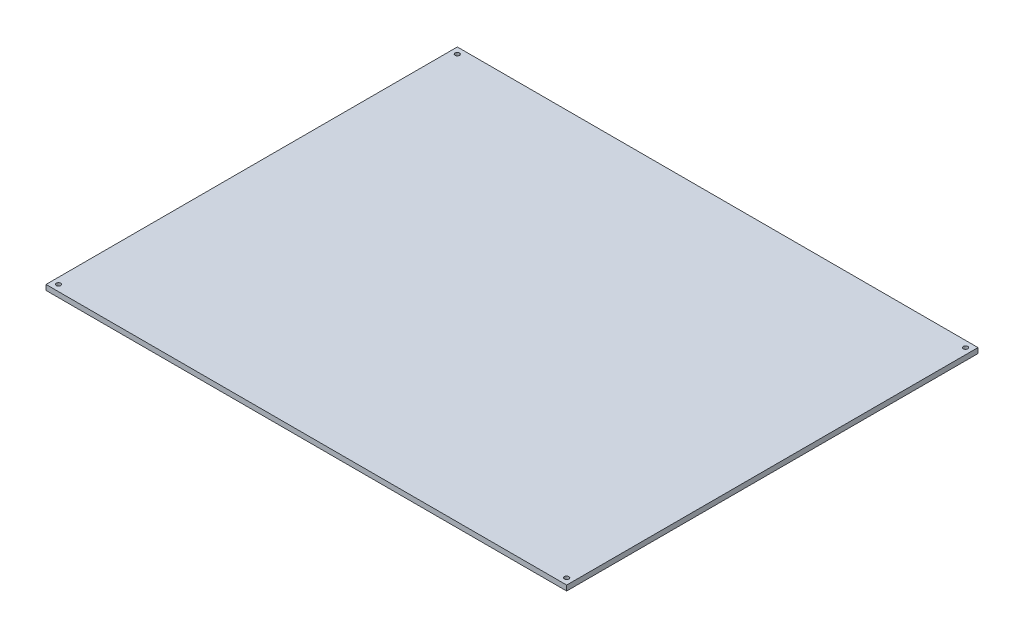
ISO-10303-21;
HEADER;
FILE_DESCRIPTION(('STEP AP214'),'2;1');
FILE_NAME('part.step','',(''),(''),'','','');
FILE_SCHEMA(('AUTOMOTIVE_DESIGN { 1 0 10303 214 1 1 1 1 }'));
ENDSEC;
DATA;
#1=APPLICATION_CONTEXT('core data for automotive mechanical design processes');
#2=APPLICATION_PROTOCOL_DEFINITION('international standard','automotive_design',2000,#1);
#3=PRODUCT_CONTEXT('',#1,'mechanical');
#4=PRODUCT('Part','Part','',(#3));
#5=PRODUCT_RELATED_PRODUCT_CATEGORY('part','',(#4));
#6=PRODUCT_DEFINITION_FORMATION('','',#4);
#7=PRODUCT_DEFINITION_CONTEXT('part definition',#1,'design');
#8=PRODUCT_DEFINITION('design','',#6,#7);
#9=PRODUCT_DEFINITION_SHAPE('','',#8);
#10=(LENGTH_UNIT() NAMED_UNIT(*) SI_UNIT(.MILLI.,.METRE.));
#11=(NAMED_UNIT(*) PLANE_ANGLE_UNIT() SI_UNIT($,.RADIAN.));
#12=(NAMED_UNIT(*) SI_UNIT($,.STERADIAN.) SOLID_ANGLE_UNIT());
#13=UNCERTAINTY_MEASURE_WITH_UNIT(LENGTH_MEASURE(1.E-05),#10,'distance_accuracy_value','');
#14=(GEOMETRIC_REPRESENTATION_CONTEXT(3) GLOBAL_UNCERTAINTY_ASSIGNED_CONTEXT((#13)) GLOBAL_UNIT_ASSIGNED_CONTEXT((#10,
#11,#12)) REPRESENTATION_CONTEXT('',''));
#15=CARTESIAN_POINT('',(0.,0.,0.));
#16=DIRECTION('',(0.,0.,1.));
#17=DIRECTION('',(1.,0.,0.));
#18=AXIS2_PLACEMENT_3D('',#15,#16,#17);
#19=CARTESIAN_POINT('',(0.,5.,0.));
#20=DIRECTION('',(0.,1.,0.));
#21=DIRECTION('',(0.,0.,1.));
#22=AXIS2_PLACEMENT_3D('',#19,#20,#21);
#23=PLANE('',#22);
#24=CARTESIAN_POINT('',(244.,5.,191.5));
#25=DIRECTION('',(0.,-1.,0.));
#26=DIRECTION('',(0.,0.,1.));
#27=AXIS2_PLACEMENT_3D('',#24,#25,#26);
#28=CIRCLE('',#27,2.09999999999999);
#29=CARTESIAN_POINT('',(244.,5.,193.6));
#30=VERTEX_POINT('',#29);
#31=EDGE_CURVE('E120',#30,#30,#28,.T.);
#32=ORIENTED_EDGE('',*,*,#31,.T.);
#33=EDGE_LOOP('',(#32));
#34=FACE_BOUND('',#33,.T.);
#35=CARTESIAN_POINT('',(-244.,5.,191.5));
#36=DIRECTION('',(0.,1.,0.));
#37=DIRECTION('',(0.,0.,1.));
#38=AXIS2_PLACEMENT_3D('',#35,#36,#37);
#39=CIRCLE('',#38,2.09999999999999);
#40=CARTESIAN_POINT('',(-244.,5.,193.6));
#41=VERTEX_POINT('',#40);
#42=EDGE_CURVE('E114',#41,#41,#39,.T.);
#43=ORIENTED_EDGE('',*,*,#42,.F.);
#44=EDGE_LOOP('',(#43));
#45=FACE_BOUND('',#44,.T.);
#46=DIRECTION('',(0.,0.,1.));
#47=VECTOR('',#46,1.);
#48=CARTESIAN_POINT('',(-250.,5.,-197.5));
#49=LINE('',#48,#47);
#50=CARTESIAN_POINT('',(-250.,5.,-197.5));
#51=VERTEX_POINT('',#50);
#52=CARTESIAN_POINT('',(-250.,5.,197.5));
#53=VERTEX_POINT('',#52);
#54=EDGE_CURVE('E87',#51,#53,#49,.T.);
#55=ORIENTED_EDGE('',*,*,#54,.T.);
#56=DIRECTION('',(1.,0.,0.));
#57=VECTOR('',#56,1.);
#58=CARTESIAN_POINT('',(-250.,5.,197.5));
#59=LINE('',#58,#57);
#60=CARTESIAN_POINT('',(250.,5.,197.5));
#61=VERTEX_POINT('',#60);
#62=EDGE_CURVE('E82',#53,#61,#59,.T.);
#63=ORIENTED_EDGE('',*,*,#62,.T.);
#64=DIRECTION('',(0.,0.,-1.));
#65=VECTOR('',#64,1.);
#66=CARTESIAN_POINT('',(250.,5.,-197.5));
#67=LINE('',#66,#65);
#68=CARTESIAN_POINT('',(250.,5.,-197.5));
#69=VERTEX_POINT('',#68);
#70=EDGE_CURVE('E85',#61,#69,#67,.T.);
#71=ORIENTED_EDGE('',*,*,#70,.T.);
#72=DIRECTION('',(-1.,0.,0.));
#73=VECTOR('',#72,1.);
#74=CARTESIAN_POINT('',(-250.,5.,-197.5));
#75=LINE('',#74,#73);
#76=EDGE_CURVE('E52',#69,#51,#75,.T.);
#77=ORIENTED_EDGE('',*,*,#76,.T.);
#78=EDGE_LOOP('',(#55,#63,#71,#77));
#79=FACE_BOUND('',#78,.T.);
#80=CARTESIAN_POINT('',(244.,5.,-191.5));
#81=DIRECTION('',(0.,1.,0.));
#82=DIRECTION('',(0.,0.,-1.));
#83=AXIS2_PLACEMENT_3D('',#80,#81,#82);
#84=CIRCLE('',#83,2.09999999999999);
#85=CARTESIAN_POINT('',(244.,5.,-193.6));
#86=VERTEX_POINT('',#85);
#87=EDGE_CURVE('E126',#86,#86,#84,.T.);
#88=ORIENTED_EDGE('',*,*,#87,.F.);
#89=EDGE_LOOP('',(#88));
#90=FACE_BOUND('',#89,.T.);
#91=CARTESIAN_POINT('',(-244.,5.,-191.5));
#92=DIRECTION('',(0.,-1.,0.));
#93=DIRECTION('',(0.,0.,-1.));
#94=AXIS2_PLACEMENT_3D('',#91,#92,#93);
#95=CIRCLE('',#94,2.09999999999999);
#96=CARTESIAN_POINT('',(-244.,5.,-193.6));
#97=VERTEX_POINT('',#96);
#98=EDGE_CURVE('E132',#97,#97,#95,.T.);
#99=ORIENTED_EDGE('',*,*,#98,.T.);
#100=EDGE_LOOP('',(#99));
#101=FACE_BOUND('',#100,.T.);
#102=ADVANCED_FACE('F35',(#34,#45,#79,#90,#101),#23,.T.);
#103=CARTESIAN_POINT('',(0.,0.,0.));
#104=DIRECTION('',(0.,1.,0.));
#105=DIRECTION('',(0.,0.,1.));
#106=AXIS2_PLACEMENT_3D('',#103,#104,#105);
#107=PLANE('',#106);
#108=CARTESIAN_POINT('',(244.,0.,191.5));
#109=DIRECTION('',(0.,-1.,0.));
#110=DIRECTION('',(0.,0.,1.));
#111=AXIS2_PLACEMENT_3D('',#108,#109,#110);
#112=CIRCLE('',#111,2.09999999999999);
#113=CARTESIAN_POINT('',(244.,0.,193.6));
#114=VERTEX_POINT('',#113);
#115=EDGE_CURVE('E117',#114,#114,#112,.T.);
#116=ORIENTED_EDGE('',*,*,#115,.F.);
#117=EDGE_LOOP('',(#116));
#118=FACE_BOUND('',#117,.T.);
#119=CARTESIAN_POINT('',(-244.,0.,191.5));
#120=DIRECTION('',(0.,1.,0.));
#121=DIRECTION('',(0.,0.,1.));
#122=AXIS2_PLACEMENT_3D('',#119,#120,#121);
#123=CIRCLE('',#122,2.09999999999999);
#124=CARTESIAN_POINT('',(-244.,0.,193.6));
#125=VERTEX_POINT('',#124);
#126=EDGE_CURVE('E102',#125,#125,#123,.T.);
#127=ORIENTED_EDGE('',*,*,#126,.T.);
#128=EDGE_LOOP('',(#127));
#129=FACE_BOUND('',#128,.T.);
#130=DIRECTION('',(0.,0.,1.));
#131=VECTOR('',#130,1.);
#132=CARTESIAN_POINT('',(-250.,0.,-197.5));
#133=LINE('',#132,#131);
#134=CARTESIAN_POINT('',(-250.,0.,-197.5));
#135=VERTEX_POINT('',#134);
#136=CARTESIAN_POINT('',(-250.,0.,197.5));
#137=VERTEX_POINT('',#136);
#138=EDGE_CURVE('E99',#135,#137,#133,.T.);
#139=ORIENTED_EDGE('',*,*,#138,.F.);
#140=DIRECTION('',(-1.,0.,0.));
#141=VECTOR('',#140,1.);
#142=CARTESIAN_POINT('',(-250.,0.,-197.5));
#143=LINE('',#142,#141);
#144=CARTESIAN_POINT('',(250.,0.,-197.5));
#145=VERTEX_POINT('',#144);
#146=EDGE_CURVE('E75',#145,#135,#143,.T.);
#147=ORIENTED_EDGE('',*,*,#146,.F.);
#148=DIRECTION('',(0.,0.,-1.));
#149=VECTOR('',#148,1.);
#150=CARTESIAN_POINT('',(250.,0.,-197.5));
#151=LINE('',#150,#149);
#152=CARTESIAN_POINT('',(250.,0.,197.5));
#153=VERTEX_POINT('',#152);
#154=EDGE_CURVE('E69',#153,#145,#151,.T.);
#155=ORIENTED_EDGE('',*,*,#154,.F.);
#156=DIRECTION('',(1.,0.,0.));
#157=VECTOR('',#156,1.);
#158=CARTESIAN_POINT('',(-250.,0.,197.5));
#159=LINE('',#158,#157);
#160=EDGE_CURVE('E91',#137,#153,#159,.T.);
#161=ORIENTED_EDGE('',*,*,#160,.F.);
#162=EDGE_LOOP('',(#139,#147,#155,#161));
#163=FACE_BOUND('',#162,.T.);
#164=CARTESIAN_POINT('',(244.,0.,-191.5));
#165=DIRECTION('',(0.,1.,0.));
#166=DIRECTION('',(0.,0.,-1.));
#167=AXIS2_PLACEMENT_3D('',#164,#165,#166);
#168=CIRCLE('',#167,2.09999999999999);
#169=CARTESIAN_POINT('',(244.,0.,-193.6));
#170=VERTEX_POINT('',#169);
#171=EDGE_CURVE('E123',#170,#170,#168,.T.);
#172=ORIENTED_EDGE('',*,*,#171,.T.);
#173=EDGE_LOOP('',(#172));
#174=FACE_BOUND('',#173,.T.);
#175=CARTESIAN_POINT('',(-244.,0.,-191.5));
#176=DIRECTION('',(0.,-1.,0.));
#177=DIRECTION('',(0.,0.,-1.));
#178=AXIS2_PLACEMENT_3D('',#175,#176,#177);
#179=CIRCLE('',#178,2.09999999999999);
#180=CARTESIAN_POINT('',(-244.,0.,-193.6));
#181=VERTEX_POINT('',#180);
#182=EDGE_CURVE('E129',#181,#181,#179,.T.);
#183=ORIENTED_EDGE('',*,*,#182,.F.);
#184=EDGE_LOOP('',(#183));
#185=FACE_BOUND('',#184,.T.);
#186=ADVANCED_FACE('F110',(#118,#129,#163,#174,#185),#107,.F.);
#187=CARTESIAN_POINT('',(-250.,5.,-197.5));
#188=DIRECTION('',(1.,0.,0.));
#189=DIRECTION('',(0.,0.,-1.));
#190=AXIS2_PLACEMENT_3D('',#187,#188,#189);
#191=PLANE('',#190);
#192=ORIENTED_EDGE('',*,*,#138,.T.);
#193=DIRECTION('',(0.,-1.,0.));
#194=VECTOR('',#193,1.);
#195=CARTESIAN_POINT('',(-250.,5.,197.5));
#196=LINE('',#195,#194);
#197=EDGE_CURVE('E11',#53,#137,#196,.T.);
#198=ORIENTED_EDGE('',*,*,#197,.F.);
#199=ORIENTED_EDGE('',*,*,#54,.F.);
#200=DIRECTION('',(0.,-1.,0.));
#201=VECTOR('',#200,1.);
#202=CARTESIAN_POINT('',(-250.,5.,-197.5));
#203=LINE('',#202,#201);
#204=EDGE_CURVE('E95',#51,#135,#203,.T.);
#205=ORIENTED_EDGE('',*,*,#204,.T.);
#206=EDGE_LOOP('',(#192,#198,#199,#205));
#207=FACE_BOUND('',#206,.T.);
#208=ADVANCED_FACE('F37',(#207),#191,.F.);
#209=CARTESIAN_POINT('',(-250.,5.,197.5));
#210=DIRECTION('',(0.,0.,-1.));
#211=DIRECTION('',(-1.,0.,0.));
#212=AXIS2_PLACEMENT_3D('',#209,#210,#211);
#213=PLANE('',#212);
#214=ORIENTED_EDGE('',*,*,#160,.T.);
#215=DIRECTION('',(0.,-1.,0.));
#216=VECTOR('',#215,1.);
#217=CARTESIAN_POINT('',(250.,5.,197.5));
#218=LINE('',#217,#216);
#219=EDGE_CURVE('E44',#61,#153,#218,.T.);
#220=ORIENTED_EDGE('',*,*,#219,.F.);
#221=ORIENTED_EDGE('',*,*,#62,.F.);
#222=ORIENTED_EDGE('',*,*,#197,.T.);
#223=EDGE_LOOP('',(#214,#220,#221,#222));
#224=FACE_BOUND('',#223,.T.);
#225=ADVANCED_FACE('F90',(#224),#213,.F.);
#226=CARTESIAN_POINT('',(250.,5.,-197.5));
#227=DIRECTION('',(-1.,0.,0.));
#228=DIRECTION('',(0.,0.,1.));
#229=AXIS2_PLACEMENT_3D('',#226,#227,#228);
#230=PLANE('',#229);
#231=ORIENTED_EDGE('',*,*,#154,.T.);
#232=DIRECTION('',(0.,-1.,0.));
#233=VECTOR('',#232,1.);
#234=CARTESIAN_POINT('',(250.,5.,-197.5));
#235=LINE('',#234,#233);
#236=EDGE_CURVE('E92',#69,#145,#235,.T.);
#237=ORIENTED_EDGE('',*,*,#236,.F.);
#238=ORIENTED_EDGE('',*,*,#70,.F.);
#239=ORIENTED_EDGE('',*,*,#219,.T.);
#240=EDGE_LOOP('',(#231,#237,#238,#239));
#241=FACE_BOUND('',#240,.T.);
#242=ADVANCED_FACE('F93',(#241),#230,.F.);
#243=CARTESIAN_POINT('',(-250.,5.,-197.5));
#244=DIRECTION('',(0.,0.,1.));
#245=DIRECTION('',(1.,0.,0.));
#246=AXIS2_PLACEMENT_3D('',#243,#244,#245);
#247=PLANE('',#246);
#248=ORIENTED_EDGE('',*,*,#146,.T.);
#249=ORIENTED_EDGE('',*,*,#204,.F.);
#250=ORIENTED_EDGE('',*,*,#76,.F.);
#251=ORIENTED_EDGE('',*,*,#236,.T.);
#252=EDGE_LOOP('',(#248,#249,#250,#251));
#253=FACE_BOUND('',#252,.T.);
#254=ADVANCED_FACE('F107',(#253),#247,.F.);
#255=CARTESIAN_POINT('',(-244.,0.,191.5));
#256=DIRECTION('',(0.,1.,0.));
#257=DIRECTION('',(0.,0.,1.));
#258=AXIS2_PLACEMENT_3D('',#255,#256,#257);
#259=CYLINDRICAL_SURFACE('',#258,2.09999999999999);
#260=ORIENTED_EDGE('',*,*,#126,.F.);
#261=EDGE_LOOP('',(#260));
#262=FACE_BOUND('',#261,.T.);
#263=ORIENTED_EDGE('',*,*,#42,.T.);
#264=EDGE_LOOP('',(#263));
#265=FACE_BOUND('',#264,.T.);
#266=ADVANCED_FACE('F156',(#262,#265),#259,.F.);
#267=CARTESIAN_POINT('',(244.,0.,191.5));
#268=DIRECTION('',(0.,1.,0.));
#269=DIRECTION('',(0.,0.,1.));
#270=AXIS2_PLACEMENT_3D('',#267,#268,#269);
#271=CYLINDRICAL_SURFACE('',#270,2.09999999999999);
#272=ORIENTED_EDGE('',*,*,#115,.T.);
#273=EDGE_LOOP('',(#272));
#274=FACE_BOUND('',#273,.T.);
#275=ORIENTED_EDGE('',*,*,#31,.F.);
#276=EDGE_LOOP('',(#275));
#277=FACE_BOUND('',#276,.T.);
#278=ADVANCED_FACE('F177',(#274,#277),#271,.F.);
#279=CARTESIAN_POINT('',(244.,0.,-191.5));
#280=DIRECTION('',(0.,1.,0.));
#281=DIRECTION('',(0.,0.,1.));
#282=AXIS2_PLACEMENT_3D('',#279,#280,#281);
#283=CYLINDRICAL_SURFACE('',#282,2.09999999999999);
#284=ORIENTED_EDGE('',*,*,#171,.F.);
#285=EDGE_LOOP('',(#284));
#286=FACE_BOUND('',#285,.T.);
#287=ORIENTED_EDGE('',*,*,#87,.T.);
#288=EDGE_LOOP('',(#287));
#289=FACE_BOUND('',#288,.T.);
#290=ADVANCED_FACE('F184',(#286,#289),#283,.F.);
#291=CARTESIAN_POINT('',(-244.,0.,-191.5));
#292=DIRECTION('',(0.,1.,0.));
#293=DIRECTION('',(0.,0.,1.));
#294=AXIS2_PLACEMENT_3D('',#291,#292,#293);
#295=CYLINDRICAL_SURFACE('',#294,2.09999999999999);
#296=ORIENTED_EDGE('',*,*,#182,.T.);
#297=EDGE_LOOP('',(#296));
#298=FACE_BOUND('',#297,.T.);
#299=ORIENTED_EDGE('',*,*,#98,.F.);
#300=EDGE_LOOP('',(#299));
#301=FACE_BOUND('',#300,.T.);
#302=ADVANCED_FACE('F138',(#298,#301),#295,.F.);
#303=CLOSED_SHELL('',(#102,#186,#208,#225,#242,#254,#266,#278,#290,#302));
#304=MANIFOLD_SOLID_BREP('B2',#303);
#305=ADVANCED_BREP_SHAPE_REPRESENTATION('',(#18,#304),#14);
#306=SHAPE_DEFINITION_REPRESENTATION(#9,#305);
ENDSEC;
END-ISO-10303-21;
